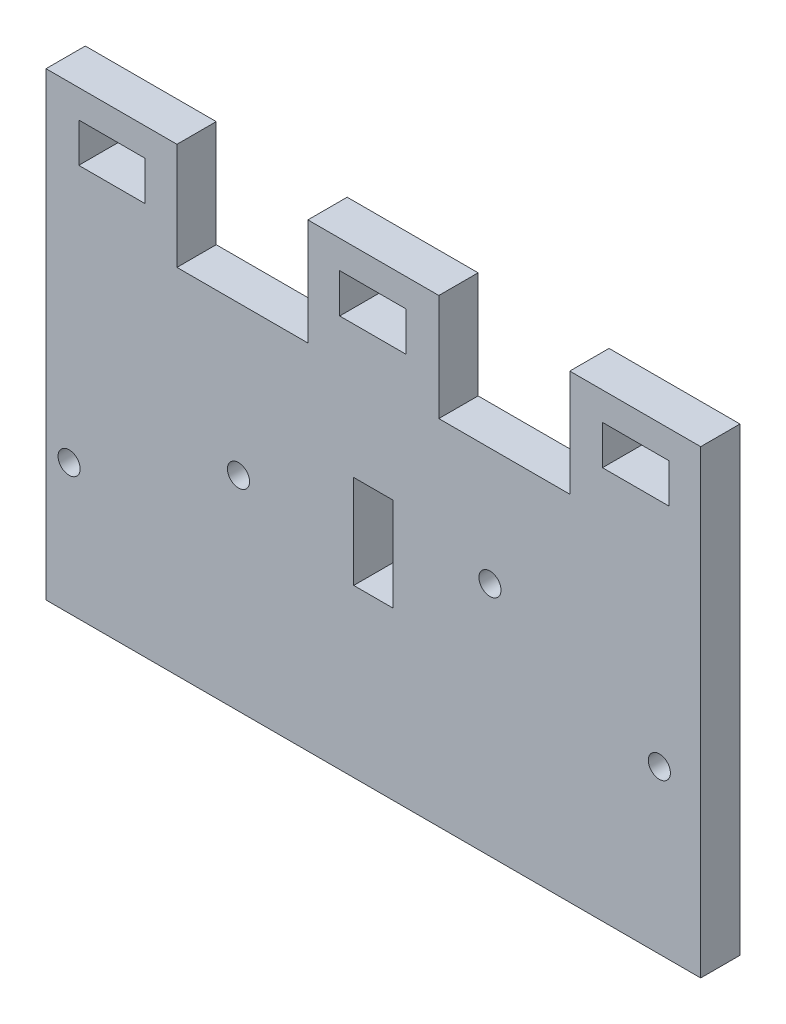
ISO-10303-21;
HEADER;
FILE_DESCRIPTION(('STEP AP214'),'2;1');
FILE_NAME('part.step','',(''),(''),'','','');
FILE_SCHEMA(('AUTOMOTIVE_DESIGN { 1 0 10303 214 1 1 1 1 }'));
ENDSEC;
DATA;
#1=APPLICATION_CONTEXT('core data for automotive mechanical design processes');
#2=APPLICATION_PROTOCOL_DEFINITION('international standard','automotive_design',2000,#1);
#3=PRODUCT_CONTEXT('',#1,'mechanical');
#4=PRODUCT('Part','Part','',(#3));
#5=PRODUCT_RELATED_PRODUCT_CATEGORY('part','',(#4));
#6=PRODUCT_DEFINITION_FORMATION('','',#4);
#7=PRODUCT_DEFINITION_CONTEXT('part definition',#1,'design');
#8=PRODUCT_DEFINITION('design','',#6,#7);
#9=PRODUCT_DEFINITION_SHAPE('','',#8);
#10=(LENGTH_UNIT() NAMED_UNIT(*) SI_UNIT(.MILLI.,.METRE.));
#11=(NAMED_UNIT(*) PLANE_ANGLE_UNIT() SI_UNIT($,.RADIAN.));
#12=(NAMED_UNIT(*) SI_UNIT($,.STERADIAN.) SOLID_ANGLE_UNIT());
#13=UNCERTAINTY_MEASURE_WITH_UNIT(LENGTH_MEASURE(1.E-05),#10,'distance_accuracy_value','');
#14=(GEOMETRIC_REPRESENTATION_CONTEXT(3) GLOBAL_UNCERTAINTY_ASSIGNED_CONTEXT((#13)) GLOBAL_UNIT_ASSIGNED_CONTEXT((#10,
#11,#12)) REPRESENTATION_CONTEXT('',''));
#15=CARTESIAN_POINT('',(0.,0.,0.));
#16=DIRECTION('',(0.,0.,1.));
#17=DIRECTION('',(1.,0.,0.));
#18=AXIS2_PLACEMENT_3D('',#15,#16,#17);
#19=CARTESIAN_POINT('',(-39.3603053435114,14.4208015267176,5.334));
#20=DIRECTION('',(0.,-1.,0.));
#21=DIRECTION('',(0.,0.,-1.));
#22=AXIS2_PLACEMENT_3D('',#19,#20,#21);
#23=PLANE('',#22);
#24=DIRECTION('',(-1.,0.,0.));
#25=VECTOR('',#24,1.);
#26=CARTESIAN_POINT('',(-39.3603053435114,14.4208015267176,5.334));
#27=LINE('',#26,#25);
#28=CARTESIAN_POINT('',(13.9796946564886,14.4208015267176,5.334));
#29=VERTEX_POINT('',#28);
#30=CARTESIAN_POINT('',(-3.80030534351144,14.4208015267176,5.334));
#31=VERTEX_POINT('',#30);
#32=EDGE_CURVE('E423',#29,#31,#27,.T.);
#33=ORIENTED_EDGE('',*,*,#32,.F.);
#34=DIRECTION('',(0.,0.,1.));
#35=VECTOR('',#34,1.);
#36=CARTESIAN_POINT('',(13.9796946564886,14.4208015267176,0.));
#37=LINE('',#36,#35);
#38=CARTESIAN_POINT('',(13.9796946564886,14.4208015267176,0.));
#39=VERTEX_POINT('',#38);
#40=EDGE_CURVE('E374',#39,#29,#37,.T.);
#41=ORIENTED_EDGE('',*,*,#40,.F.);
#42=DIRECTION('',(-1.,0.,0.));
#43=VECTOR('',#42,1.);
#44=CARTESIAN_POINT('',(-39.3603053435114,14.4208015267176,0.));
#45=LINE('',#44,#43);
#46=CARTESIAN_POINT('',(-3.80030534351144,14.4208015267176,0.));
#47=VERTEX_POINT('',#46);
#48=EDGE_CURVE('E433',#39,#47,#45,.T.);
#49=ORIENTED_EDGE('',*,*,#48,.T.);
#50=DIRECTION('',(0.,0.,1.));
#51=VECTOR('',#50,1.);
#52=CARTESIAN_POINT('',(-3.80030534351144,14.4208015267176,0.));
#53=LINE('',#52,#51);
#54=EDGE_CURVE('E404',#47,#31,#53,.T.);
#55=ORIENTED_EDGE('',*,*,#54,.T.);
#56=EDGE_LOOP('',(#33,#41,#49,#55));
#57=FACE_BOUND('',#56,.T.);
#58=ADVANCED_FACE('F35',(#57),#23,.F.);
#59=CARTESIAN_POINT('',(-21.5803053435114,14.4208015267176,5.334));
#60=VERTEX_POINT('',#59);
#61=CARTESIAN_POINT('',(-39.3603053435114,14.4208015267176,5.334));
#62=VERTEX_POINT('',#61);
#63=EDGE_CURVE('E418',#60,#62,#27,.T.);
#64=ORIENTED_EDGE('',*,*,#63,.F.);
#65=DIRECTION('',(0.,0.,1.));
#66=VECTOR('',#65,1.);
#67=CARTESIAN_POINT('',(-21.5803053435114,14.4208015267176,0.));
#68=LINE('',#67,#66);
#69=CARTESIAN_POINT('',(-21.5803053435114,14.4208015267176,0.));
#70=VERTEX_POINT('',#69);
#71=EDGE_CURVE('E401',#70,#60,#68,.T.);
#72=ORIENTED_EDGE('',*,*,#71,.F.);
#73=CARTESIAN_POINT('',(-39.3603053435114,14.4208015267176,0.));
#74=VERTEX_POINT('',#73);
#75=EDGE_CURVE('E430',#70,#74,#45,.T.);
#76=ORIENTED_EDGE('',*,*,#75,.T.);
#77=DIRECTION('',(0.,0.,-1.));
#78=VECTOR('',#77,1.);
#79=CARTESIAN_POINT('',(-39.3603053435114,14.4208015267176,5.334));
#80=LINE('',#79,#78);
#81=EDGE_CURVE('E422',#62,#74,#80,.T.);
#82=ORIENTED_EDGE('',*,*,#81,.F.);
#83=EDGE_LOOP('',(#64,#72,#76,#82));
#84=FACE_BOUND('',#83,.T.);
#85=ADVANCED_FACE('F480',(#84),#23,.F.);
#86=CARTESIAN_POINT('',(-39.3603053435114,14.4208015267176,5.334));
#87=DIRECTION('',(1.,0.,0.));
#88=DIRECTION('',(0.,1.,0.));
#89=AXIS2_PLACEMENT_3D('',#86,#87,#88);
#90=PLANE('',#89);
#91=DIRECTION('',(0.,-1.,0.));
#92=VECTOR('',#91,1.);
#93=CARTESIAN_POINT('',(-39.3603053435114,14.4208015267176,0.));
#94=LINE('',#93,#92);
#95=CARTESIAN_POINT('',(-39.3603053435114,-48.0631984732824,0.));
#96=VERTEX_POINT('',#95);
#97=EDGE_CURVE('E403',#74,#96,#94,.T.);
#98=ORIENTED_EDGE('',*,*,#97,.T.);
#99=DIRECTION('',(0.,0.,-1.));
#100=VECTOR('',#99,1.);
#101=CARTESIAN_POINT('',(-39.3603053435114,-48.0631984732824,5.334));
#102=LINE('',#101,#100);
#103=CARTESIAN_POINT('',(-39.3603053435114,-48.0631984732824,5.334));
#104=VERTEX_POINT('',#103);
#105=EDGE_CURVE('E11',#104,#96,#102,.T.);
#106=ORIENTED_EDGE('',*,*,#105,.F.);
#107=DIRECTION('',(0.,-1.,0.));
#108=VECTOR('',#107,1.);
#109=CARTESIAN_POINT('',(-39.3603053435114,14.4208015267176,5.334));
#110=LINE('',#109,#108);
#111=EDGE_CURVE('E410',#62,#104,#110,.T.);
#112=ORIENTED_EDGE('',*,*,#111,.F.);
#113=ORIENTED_EDGE('',*,*,#81,.T.);
#114=EDGE_LOOP('',(#98,#106,#112,#113));
#115=FACE_BOUND('',#114,.T.);
#116=ADVANCED_FACE('F37',(#115),#90,.F.);
#117=CARTESIAN_POINT('',(-39.3603053435114,-48.0631984732824,5.334));
#118=DIRECTION('',(0.,1.,0.));
#119=DIRECTION('',(0.,0.,1.));
#120=AXIS2_PLACEMENT_3D('',#117,#118,#119);
#121=PLANE('',#120);
#122=DIRECTION('',(1.,0.,0.));
#123=VECTOR('',#122,1.);
#124=CARTESIAN_POINT('',(-39.3603053435114,-48.0631984732824,0.));
#125=LINE('',#124,#123);
#126=CARTESIAN_POINT('',(49.5396946564886,-48.0631984732824,0.));
#127=VERTEX_POINT('',#126);
#128=EDGE_CURVE('E426',#96,#127,#125,.T.);
#129=ORIENTED_EDGE('',*,*,#128,.T.);
#130=DIRECTION('',(0.,0.,-1.));
#131=VECTOR('',#130,1.);
#132=CARTESIAN_POINT('',(49.5396946564886,-48.0631984732824,5.334));
#133=LINE('',#132,#131);
#134=CARTESIAN_POINT('',(49.5396946564886,-48.0631984732824,5.334));
#135=VERTEX_POINT('',#134);
#136=EDGE_CURVE('E43',#135,#127,#133,.T.);
#137=ORIENTED_EDGE('',*,*,#136,.F.);
#138=DIRECTION('',(1.,0.,0.));
#139=VECTOR('',#138,1.);
#140=CARTESIAN_POINT('',(-39.3603053435114,-48.0631984732824,5.334));
#141=LINE('',#140,#139);
#142=EDGE_CURVE('E413',#104,#135,#141,.T.);
#143=ORIENTED_EDGE('',*,*,#142,.F.);
#144=ORIENTED_EDGE('',*,*,#105,.T.);
#145=EDGE_LOOP('',(#129,#137,#143,#144));
#146=FACE_BOUND('',#145,.T.);
#147=ADVANCED_FACE('F460',(#146),#121,.F.);
#148=CARTESIAN_POINT('',(49.5396946564886,14.4208015267176,5.334));
#149=DIRECTION('',(-1.,0.,0.));
#150=DIRECTION('',(0.,0.,1.));
#151=AXIS2_PLACEMENT_3D('',#148,#149,#150);
#152=PLANE('',#151);
#153=DIRECTION('',(0.,1.,0.));
#154=VECTOR('',#153,1.);
#155=CARTESIAN_POINT('',(49.5396946564886,14.4208015267176,0.));
#156=LINE('',#155,#154);
#157=CARTESIAN_POINT('',(49.5396946564886,14.4208015267176,0.));
#158=VERTEX_POINT('',#157);
#159=EDGE_CURVE('E428',#127,#158,#156,.T.);
#160=ORIENTED_EDGE('',*,*,#159,.T.);
#161=DIRECTION('',(0.,0.,-1.));
#162=VECTOR('',#161,1.);
#163=CARTESIAN_POINT('',(49.5396946564886,14.4208015267176,5.334));
#164=LINE('',#163,#162);
#165=CARTESIAN_POINT('',(49.5396946564886,14.4208015267176,5.334));
#166=VERTEX_POINT('',#165);
#167=EDGE_CURVE('E436',#166,#158,#164,.T.);
#168=ORIENTED_EDGE('',*,*,#167,.F.);
#169=DIRECTION('',(0.,1.,0.));
#170=VECTOR('',#169,1.);
#171=CARTESIAN_POINT('',(49.5396946564886,14.4208015267176,5.334));
#172=LINE('',#171,#170);
#173=EDGE_CURVE('E416',#135,#166,#172,.T.);
#174=ORIENTED_EDGE('',*,*,#173,.F.);
#175=ORIENTED_EDGE('',*,*,#136,.T.);
#176=EDGE_LOOP('',(#160,#168,#174,#175));
#177=FACE_BOUND('',#176,.T.);
#178=ADVANCED_FACE('F443',(#177),#152,.F.);
#179=CARTESIAN_POINT('',(31.7596946564886,14.4208015267176,0.));
#180=VERTEX_POINT('',#179);
#181=EDGE_CURVE('E414',#158,#180,#45,.T.);
#182=ORIENTED_EDGE('',*,*,#181,.T.);
#183=DIRECTION('',(0.,0.,1.));
#184=VECTOR('',#183,1.);
#185=CARTESIAN_POINT('',(31.7596946564886,14.4208015267176,0.));
#186=LINE('',#185,#184);
#187=CARTESIAN_POINT('',(31.7596946564886,14.4208015267176,5.334));
#188=VERTEX_POINT('',#187);
#189=EDGE_CURVE('E377',#180,#188,#186,.T.);
#190=ORIENTED_EDGE('',*,*,#189,.T.);
#191=EDGE_CURVE('E419',#166,#188,#27,.T.);
#192=ORIENTED_EDGE('',*,*,#191,.F.);
#193=ORIENTED_EDGE('',*,*,#167,.T.);
#194=EDGE_LOOP('',(#182,#190,#192,#193));
#195=FACE_BOUND('',#194,.T.);
#196=ADVANCED_FACE('F451',(#195),#23,.F.);
#197=CARTESIAN_POINT('',(0.,0.,5.334));
#198=DIRECTION('',(0.,0.,1.));
#199=DIRECTION('',(1.,0.,0.));
#200=AXIS2_PLACEMENT_3D('',#197,#198,#199);
#201=PLANE('',#200);
#202=CARTESIAN_POINT('',(-13.2253053435115,-20.3291984732823,5.334));
#203=DIRECTION('',(0.,0.,1.));
#204=DIRECTION('',(1.,0.,0.));
#205=AXIS2_PLACEMENT_3D('',#202,#203,#204);
#206=CIRCLE('',#205,1.50000000000063);
#207=CARTESIAN_POINT('',(-11.7253053435109,-20.3291984732823,5.334));
#208=VERTEX_POINT('',#207);
#209=EDGE_CURVE('E799',#208,#208,#206,.T.);
#210=ORIENTED_EDGE('',*,*,#209,.F.);
#211=EDGE_LOOP('',(#210));
#212=FACE_BOUND('',#211,.T.);
#213=CARTESIAN_POINT('',(43.9246946564889,-26.0111984732834,5.334));
#214=DIRECTION('',(0.,0.,1.));
#215=DIRECTION('',(1.,0.,0.));
#216=AXIS2_PLACEMENT_3D('',#213,#214,#215);
#217=CIRCLE('',#216,1.50000000000195);
#218=CARTESIAN_POINT('',(45.4246946564909,-26.0111984732834,5.334));
#219=VERTEX_POINT('',#218);
#220=EDGE_CURVE('E803',#219,#219,#217,.T.);
#221=ORIENTED_EDGE('',*,*,#220,.F.);
#222=EDGE_LOOP('',(#221));
#223=FACE_BOUND('',#222,.T.);
#224=CARTESIAN_POINT('',(20.9246946564889,-16.0111984732834,5.334));
#225=DIRECTION('',(0.,0.,1.));
#226=DIRECTION('',(1.,0.,0.));
#227=AXIS2_PLACEMENT_3D('',#224,#225,#226);
#228=CIRCLE('',#227,1.50000000000195);
#229=CARTESIAN_POINT('',(22.4246946564909,-16.0111984732834,5.334));
#230=VERTEX_POINT('',#229);
#231=EDGE_CURVE('E810',#230,#230,#228,.T.);
#232=ORIENTED_EDGE('',*,*,#231,.F.);
#233=EDGE_LOOP('',(#232));
#234=FACE_BOUND('',#233,.T.);
#235=CARTESIAN_POINT('',(-36.2253053435115,-30.3291984732823,5.334));
#236=DIRECTION('',(0.,0.,1.));
#237=DIRECTION('',(1.,0.,0.));
#238=AXIS2_PLACEMENT_3D('',#235,#236,#237);
#239=CIRCLE('',#238,1.50000000000063);
#240=CARTESIAN_POINT('',(-34.7253053435109,-30.3291984732823,5.334));
#241=VERTEX_POINT('',#240);
#242=EDGE_CURVE('E244',#241,#241,#239,.T.);
#243=ORIENTED_EDGE('',*,*,#242,.F.);
#244=EDGE_LOOP('',(#243));
#245=FACE_BOUND('',#244,.T.);
#246=DIRECTION('',(0.,-1.,0.));
#247=VECTOR('',#246,1.);
#248=CARTESIAN_POINT('',(2.42269465648857,-12.7571984732824,5.334));
#249=LINE('',#248,#247);
#250=CARTESIAN_POINT('',(2.42269465648857,-12.7571984732824,5.334));
#251=VERTEX_POINT('',#250);
#252=CARTESIAN_POINT('',(2.42269465648857,-25.4571984732824,5.334));
#253=VERTEX_POINT('',#252);
#254=EDGE_CURVE('E50',#251,#253,#249,.T.);
#255=ORIENTED_EDGE('',*,*,#254,.F.);
#256=DIRECTION('',(-1.,0.,0.));
#257=VECTOR('',#256,1.);
#258=CARTESIAN_POINT('',(2.42269465648857,-12.7571984732824,5.334));
#259=LINE('',#258,#257);
#260=CARTESIAN_POINT('',(7.75669465648856,-12.7571984732824,5.334));
#261=VERTEX_POINT('',#260);
#262=EDGE_CURVE('E238',#261,#251,#259,.T.);
#263=ORIENTED_EDGE('',*,*,#262,.F.);
#264=DIRECTION('',(0.,1.,0.));
#265=VECTOR('',#264,1.);
#266=CARTESIAN_POINT('',(7.75669465648856,-12.7571984732824,5.334));
#267=LINE('',#266,#265);
#268=CARTESIAN_POINT('',(7.75669465648857,-25.4571984732824,5.334));
#269=VERTEX_POINT('',#268);
#270=EDGE_CURVE('E241',#269,#261,#267,.T.);
#271=ORIENTED_EDGE('',*,*,#270,.F.);
#272=DIRECTION('',(1.,0.,0.));
#273=VECTOR('',#272,1.);
#274=CARTESIAN_POINT('',(2.42269465648857,-25.4571984732824,5.334));
#275=LINE('',#274,#273);
#276=EDGE_CURVE('E250',#253,#269,#275,.T.);
#277=ORIENTED_EDGE('',*,*,#276,.F.);
#278=EDGE_LOOP('',(#255,#263,#271,#277));
#279=FACE_BOUND('',#278,.T.);
#280=DIRECTION('',(0.,-1.,0.));
#281=VECTOR('',#280,1.);
#282=CARTESIAN_POINT('',(36.2046946564886,10.6108015267176,5.334));
#283=LINE('',#282,#281);
#284=CARTESIAN_POINT('',(36.2046946564886,10.6108015267176,5.334));
#285=VERTEX_POINT('',#284);
#286=CARTESIAN_POINT('',(36.2046946564886,5.27680152671757,5.334));
#287=VERTEX_POINT('',#286);
#288=EDGE_CURVE('E257',#285,#287,#283,.T.);
#289=ORIENTED_EDGE('',*,*,#288,.F.);
#290=DIRECTION('',(-1.,0.,0.));
#291=VECTOR('',#290,1.);
#292=CARTESIAN_POINT('',(36.2046946564886,10.6108015267176,5.334));
#293=LINE('',#292,#291);
#294=CARTESIAN_POINT('',(45.2216946564886,10.6108015267176,5.334));
#295=VERTEX_POINT('',#294);
#296=EDGE_CURVE('E265',#295,#285,#293,.T.);
#297=ORIENTED_EDGE('',*,*,#296,.F.);
#298=DIRECTION('',(0.,1.,0.));
#299=VECTOR('',#298,1.);
#300=CARTESIAN_POINT('',(45.2216946564886,10.6108015267176,5.334));
#301=LINE('',#300,#299);
#302=CARTESIAN_POINT('',(45.2216946564886,5.27680152671757,5.334));
#303=VERTEX_POINT('',#302);
#304=EDGE_CURVE('E279',#303,#295,#301,.T.);
#305=ORIENTED_EDGE('',*,*,#304,.F.);
#306=DIRECTION('',(1.,0.,0.));
#307=VECTOR('',#306,1.);
#308=CARTESIAN_POINT('',(36.2046946564886,5.27680152671757,5.334));
#309=LINE('',#308,#307);
#310=EDGE_CURVE('E276',#287,#303,#309,.T.);
#311=ORIENTED_EDGE('',*,*,#310,.F.);
#312=EDGE_LOOP('',(#289,#297,#305,#311));
#313=FACE_BOUND('',#312,.T.);
#314=DIRECTION('',(-1.,0.,0.));
#315=VECTOR('',#314,1.);
#316=CARTESIAN_POINT('',(9.53469465648856,10.6108015267176,5.334));
#317=LINE('',#316,#315);
#318=CARTESIAN_POINT('',(9.53469465648856,10.6108015267176,5.334));
#319=VERTEX_POINT('',#318);
#320=CARTESIAN_POINT('',(0.51769465648855,10.6108015267176,5.334));
#321=VERTEX_POINT('',#320);
#322=EDGE_CURVE('E286',#319,#321,#317,.T.);
#323=ORIENTED_EDGE('',*,*,#322,.F.);
#324=DIRECTION('',(0.,1.,0.));
#325=VECTOR('',#324,1.);
#326=CARTESIAN_POINT('',(9.53469465648856,10.6108015267176,5.334));
#327=LINE('',#326,#325);
#328=CARTESIAN_POINT('',(9.53469465648857,5.27680152671757,5.334));
#329=VERTEX_POINT('',#328);
#330=EDGE_CURVE('E297',#329,#319,#327,.T.);
#331=ORIENTED_EDGE('',*,*,#330,.F.);
#332=DIRECTION('',(1.,0.,0.));
#333=VECTOR('',#332,1.);
#334=CARTESIAN_POINT('',(9.53469465648857,5.27680152671757,5.334));
#335=LINE('',#334,#333);
#336=CARTESIAN_POINT('',(0.51769465648855,5.27680152671757,5.334));
#337=VERTEX_POINT('',#336);
#338=EDGE_CURVE('E311',#337,#329,#335,.T.);
#339=ORIENTED_EDGE('',*,*,#338,.F.);
#340=DIRECTION('',(0.,-1.,0.));
#341=VECTOR('',#340,1.);
#342=CARTESIAN_POINT('',(0.51769465648855,10.6108015267176,5.334));
#343=LINE('',#342,#341);
#344=EDGE_CURVE('E308',#321,#337,#343,.T.);
#345=ORIENTED_EDGE('',*,*,#344,.F.);
#346=EDGE_LOOP('',(#323,#331,#339,#345));
#347=FACE_BOUND('',#346,.T.);
#348=DIRECTION('',(0.,-1.,0.));
#349=VECTOR('',#348,1.);
#350=CARTESIAN_POINT('',(-34.9153053435114,10.6108015267176,5.334));
#351=LINE('',#350,#349);
#352=CARTESIAN_POINT('',(-34.9153053435114,10.6108015267176,5.334));
#353=VERTEX_POINT('',#352);
#354=CARTESIAN_POINT('',(-34.9153053435114,5.27680152671757,5.334));
#355=VERTEX_POINT('',#354);
#356=EDGE_CURVE('E318',#353,#355,#351,.T.);
#357=ORIENTED_EDGE('',*,*,#356,.F.);
#358=DIRECTION('',(-1.,0.,0.));
#359=VECTOR('',#358,1.);
#360=CARTESIAN_POINT('',(-34.9153053435114,10.6108015267176,5.334));
#361=LINE('',#360,#359);
#362=CARTESIAN_POINT('',(-25.8983053435114,10.6108015267176,5.334));
#363=VERTEX_POINT('',#362);
#364=EDGE_CURVE('E329',#363,#353,#361,.T.);
#365=ORIENTED_EDGE('',*,*,#364,.F.);
#366=DIRECTION('',(0.,1.,0.));
#367=VECTOR('',#366,1.);
#368=CARTESIAN_POINT('',(-25.8983053435114,10.6108015267176,5.334));
#369=LINE('',#368,#367);
#370=CARTESIAN_POINT('',(-25.8983053435114,5.27680152671757,5.334));
#371=VERTEX_POINT('',#370);
#372=EDGE_CURVE('E343',#371,#363,#369,.T.);
#373=ORIENTED_EDGE('',*,*,#372,.F.);
#374=DIRECTION('',(1.,0.,0.));
#375=VECTOR('',#374,1.);
#376=CARTESIAN_POINT('',(-34.9153053435114,5.27680152671757,5.334));
#377=LINE('',#376,#375);
#378=EDGE_CURVE('E340',#355,#371,#377,.T.);
#379=ORIENTED_EDGE('',*,*,#378,.F.);
#380=EDGE_LOOP('',(#357,#365,#373,#379));
#381=FACE_BOUND('',#380,.T.);
#382=DIRECTION('',(0.,-1.,0.));
#383=VECTOR('',#382,1.);
#384=CARTESIAN_POINT('',(13.9796946564886,14.4208015267176,5.334));
#385=LINE('',#384,#383);
#386=CARTESIAN_POINT('',(13.9796946564886,-0.0571984732824337,5.334));
#387=VERTEX_POINT('',#386);
#388=EDGE_CURVE('E350',#29,#387,#385,.T.);
#389=ORIENTED_EDGE('',*,*,#388,.F.);
#390=ORIENTED_EDGE('',*,*,#32,.T.);
#391=DIRECTION('',(0.,1.,0.));
#392=VECTOR('',#391,1.);
#393=CARTESIAN_POINT('',(-3.80030534351144,14.4208015267176,5.334));
#394=LINE('',#393,#392);
#395=CARTESIAN_POINT('',(-3.80030534351144,-0.0571984732824337,5.334));
#396=VERTEX_POINT('',#395);
#397=EDGE_CURVE('E387',#396,#31,#394,.T.);
#398=ORIENTED_EDGE('',*,*,#397,.F.);
#399=DIRECTION('',(1.,0.,0.));
#400=VECTOR('',#399,1.);
#401=CARTESIAN_POINT('',(-21.5803053435114,-0.0571984732824337,5.334));
#402=LINE('',#401,#400);
#403=CARTESIAN_POINT('',(-21.5803053435114,-0.0571984732824337,5.334));
#404=VERTEX_POINT('',#403);
#405=EDGE_CURVE('E396',#404,#396,#402,.T.);
#406=ORIENTED_EDGE('',*,*,#405,.F.);
#407=DIRECTION('',(0.,-1.,0.));
#408=VECTOR('',#407,1.);
#409=CARTESIAN_POINT('',(-21.5803053435114,14.4208015267176,5.334));
#410=LINE('',#409,#408);
#411=EDGE_CURVE('E376',#60,#404,#410,.T.);
#412=ORIENTED_EDGE('',*,*,#411,.F.);
#413=ORIENTED_EDGE('',*,*,#63,.T.);
#414=ORIENTED_EDGE('',*,*,#111,.T.);
#415=ORIENTED_EDGE('',*,*,#142,.T.);
#416=ORIENTED_EDGE('',*,*,#173,.T.);
#417=ORIENTED_EDGE('',*,*,#191,.T.);
#418=DIRECTION('',(0.,1.,0.));
#419=VECTOR('',#418,1.);
#420=CARTESIAN_POINT('',(31.7596946564886,14.4208015267176,5.334));
#421=LINE('',#420,#419);
#422=CARTESIAN_POINT('',(31.7596946564886,-0.0571984732824337,5.334));
#423=VERTEX_POINT('',#422);
#424=EDGE_CURVE('E361',#423,#188,#421,.T.);
#425=ORIENTED_EDGE('',*,*,#424,.F.);
#426=DIRECTION('',(1.,0.,0.));
#427=VECTOR('',#426,1.);
#428=CARTESIAN_POINT('',(13.9796946564886,-0.0571984732824337,5.334));
#429=LINE('',#428,#427);
#430=EDGE_CURVE('E370',#387,#423,#429,.T.);
#431=ORIENTED_EDGE('',*,*,#430,.F.);
#432=EDGE_LOOP('',(#389,#390,#398,#406,#412,#413,#414,#415,#416,#417,#425,#431));
#433=FACE_BOUND('',#432,.T.);
#434=ADVANCED_FACE('F456',(#212,#223,#234,#245,#279,#313,#347,#381,#433),#201,.T.);
#435=CARTESIAN_POINT('',(0.,0.,0.));
#436=DIRECTION('',(0.,0.,1.));
#437=DIRECTION('',(1.,0.,0.));
#438=AXIS2_PLACEMENT_3D('',#435,#436,#437);
#439=PLANE('',#438);
#440=CARTESIAN_POINT('',(-13.2253053435115,-20.3291984732823,0.));
#441=DIRECTION('',(0.,0.,1.));
#442=DIRECTION('',(1.,0.,0.));
#443=AXIS2_PLACEMENT_3D('',#440,#441,#442);
#444=CIRCLE('',#443,1.50000000000063);
#445=CARTESIAN_POINT('',(-11.7253053435109,-20.3291984732823,0.));
#446=VERTEX_POINT('',#445);
#447=EDGE_CURVE('E796',#446,#446,#444,.T.);
#448=ORIENTED_EDGE('',*,*,#447,.T.);
#449=EDGE_LOOP('',(#448));
#450=FACE_BOUND('',#449,.T.);
#451=CARTESIAN_POINT('',(43.9246946564889,-26.0111984732834,0.));
#452=DIRECTION('',(0.,0.,1.));
#453=DIRECTION('',(1.,0.,0.));
#454=AXIS2_PLACEMENT_3D('',#451,#452,#453);
#455=CIRCLE('',#454,1.50000000000195);
#456=CARTESIAN_POINT('',(45.4246946564909,-26.0111984732834,0.));
#457=VERTEX_POINT('',#456);
#458=EDGE_CURVE('E800',#457,#457,#455,.T.);
#459=ORIENTED_EDGE('',*,*,#458,.T.);
#460=EDGE_LOOP('',(#459));
#461=FACE_BOUND('',#460,.T.);
#462=CARTESIAN_POINT('',(20.9246946564889,-16.0111984732834,0.));
#463=DIRECTION('',(0.,0.,1.));
#464=DIRECTION('',(1.,0.,0.));
#465=AXIS2_PLACEMENT_3D('',#462,#463,#464);
#466=CIRCLE('',#465,1.50000000000195);
#467=CARTESIAN_POINT('',(22.4246946564909,-16.0111984732834,0.));
#468=VERTEX_POINT('',#467);
#469=EDGE_CURVE('E808',#468,#468,#466,.T.);
#470=ORIENTED_EDGE('',*,*,#469,.T.);
#471=EDGE_LOOP('',(#470));
#472=FACE_BOUND('',#471,.T.);
#473=CARTESIAN_POINT('',(-36.2253053435115,-30.3291984732823,0.));
#474=DIRECTION('',(0.,0.,1.));
#475=DIRECTION('',(1.,0.,0.));
#476=AXIS2_PLACEMENT_3D('',#473,#474,#475);
#477=CIRCLE('',#476,1.50000000000063);
#478=CARTESIAN_POINT('',(-34.7253053435109,-30.3291984732823,0.));
#479=VERTEX_POINT('',#478);
#480=EDGE_CURVE('E251',#479,#479,#477,.T.);
#481=ORIENTED_EDGE('',*,*,#480,.T.);
#482=EDGE_LOOP('',(#481));
#483=FACE_BOUND('',#482,.T.);
#484=DIRECTION('',(-1.,0.,0.));
#485=VECTOR('',#484,1.);
#486=CARTESIAN_POINT('',(2.42269465648857,-12.7571984732824,0.));
#487=LINE('',#486,#485);
#488=CARTESIAN_POINT('',(7.75669465648856,-12.7571984732824,0.));
#489=VERTEX_POINT('',#488);
#490=CARTESIAN_POINT('',(2.42269465648857,-12.7571984732824,0.));
#491=VERTEX_POINT('',#490);
#492=EDGE_CURVE('E228',#489,#491,#487,.T.);
#493=ORIENTED_EDGE('',*,*,#492,.T.);
#494=DIRECTION('',(0.,-1.,0.));
#495=VECTOR('',#494,1.);
#496=CARTESIAN_POINT('',(2.42269465648857,-12.7571984732824,0.));
#497=LINE('',#496,#495);
#498=CARTESIAN_POINT('',(2.42269465648857,-25.4571984732824,0.));
#499=VERTEX_POINT('',#498);
#500=EDGE_CURVE('E222',#491,#499,#497,.T.);
#501=ORIENTED_EDGE('',*,*,#500,.T.);
#502=DIRECTION('',(1.,0.,0.));
#503=VECTOR('',#502,1.);
#504=CARTESIAN_POINT('',(2.42269465648857,-25.4571984732824,0.));
#505=LINE('',#504,#503);
#506=CARTESIAN_POINT('',(7.75669465648857,-25.4571984732824,0.));
#507=VERTEX_POINT('',#506);
#508=EDGE_CURVE('E231',#499,#507,#505,.T.);
#509=ORIENTED_EDGE('',*,*,#508,.T.);
#510=DIRECTION('',(0.,1.,0.));
#511=VECTOR('',#510,1.);
#512=CARTESIAN_POINT('',(7.75669465648856,-12.7571984732824,0.));
#513=LINE('',#512,#511);
#514=EDGE_CURVE('E58',#507,#489,#513,.T.);
#515=ORIENTED_EDGE('',*,*,#514,.T.);
#516=EDGE_LOOP('',(#493,#501,#509,#515));
#517=FACE_BOUND('',#516,.T.);
#518=DIRECTION('',(-1.,0.,0.));
#519=VECTOR('',#518,1.);
#520=CARTESIAN_POINT('',(36.2046946564886,10.6108015267176,0.));
#521=LINE('',#520,#519);
#522=CARTESIAN_POINT('',(45.2216946564886,10.6108015267176,0.));
#523=VERTEX_POINT('',#522);
#524=CARTESIAN_POINT('',(36.2046946564886,10.6108015267176,0.));
#525=VERTEX_POINT('',#524);
#526=EDGE_CURVE('E271',#523,#525,#521,.T.);
#527=ORIENTED_EDGE('',*,*,#526,.T.);
#528=DIRECTION('',(0.,-1.,0.));
#529=VECTOR('',#528,1.);
#530=CARTESIAN_POINT('',(36.2046946564886,10.6108015267176,0.));
#531=LINE('',#530,#529);
#532=CARTESIAN_POINT('',(36.2046946564886,5.27680152671757,0.));
#533=VERTEX_POINT('',#532);
#534=EDGE_CURVE('E261',#525,#533,#531,.T.);
#535=ORIENTED_EDGE('',*,*,#534,.T.);
#536=DIRECTION('',(1.,0.,0.));
#537=VECTOR('',#536,1.);
#538=CARTESIAN_POINT('',(36.2046946564886,5.27680152671757,0.));
#539=LINE('',#538,#537);
#540=CARTESIAN_POINT('',(45.2216946564886,5.27680152671757,0.));
#541=VERTEX_POINT('',#540);
#542=EDGE_CURVE('E264',#533,#541,#539,.T.);
#543=ORIENTED_EDGE('',*,*,#542,.T.);
#544=DIRECTION('',(0.,1.,0.));
#545=VECTOR('',#544,1.);
#546=CARTESIAN_POINT('',(45.2216946564886,10.6108015267176,0.));
#547=LINE('',#546,#545);
#548=EDGE_CURVE('E268',#541,#523,#547,.T.);
#549=ORIENTED_EDGE('',*,*,#548,.T.);
#550=EDGE_LOOP('',(#527,#535,#543,#549));
#551=FACE_BOUND('',#550,.T.);
#552=DIRECTION('',(0.,1.,0.));
#553=VECTOR('',#552,1.);
#554=CARTESIAN_POINT('',(9.53469465648856,10.6108015267176,0.));
#555=LINE('',#554,#553);
#556=CARTESIAN_POINT('',(9.53469465648857,5.27680152671757,0.));
#557=VERTEX_POINT('',#556);
#558=CARTESIAN_POINT('',(9.53469465648856,10.6108015267176,0.));
#559=VERTEX_POINT('',#558);
#560=EDGE_CURVE('E303',#557,#559,#555,.T.);
#561=ORIENTED_EDGE('',*,*,#560,.T.);
#562=DIRECTION('',(-1.,0.,0.));
#563=VECTOR('',#562,1.);
#564=CARTESIAN_POINT('',(9.53469465648856,10.6108015267176,0.));
#565=LINE('',#564,#563);
#566=CARTESIAN_POINT('',(0.51769465648855,10.6108015267176,0.));
#567=VERTEX_POINT('',#566);
#568=EDGE_CURVE('E293',#559,#567,#565,.T.);
#569=ORIENTED_EDGE('',*,*,#568,.T.);
#570=DIRECTION('',(0.,-1.,0.));
#571=VECTOR('',#570,1.);
#572=CARTESIAN_POINT('',(0.51769465648855,10.6108015267176,0.));
#573=LINE('',#572,#571);
#574=CARTESIAN_POINT('',(0.51769465648855,5.27680152671757,0.));
#575=VERTEX_POINT('',#574);
#576=EDGE_CURVE('E296',#567,#575,#573,.T.);
#577=ORIENTED_EDGE('',*,*,#576,.T.);
#578=DIRECTION('',(1.,0.,0.));
#579=VECTOR('',#578,1.);
#580=CARTESIAN_POINT('',(9.53469465648857,5.27680152671757,0.));
#581=LINE('',#580,#579);
#582=EDGE_CURVE('E300',#575,#557,#581,.T.);
#583=ORIENTED_EDGE('',*,*,#582,.T.);
#584=EDGE_LOOP('',(#561,#569,#577,#583));
#585=FACE_BOUND('',#584,.T.);
#586=DIRECTION('',(-1.,0.,0.));
#587=VECTOR('',#586,1.);
#588=CARTESIAN_POINT('',(-34.9153053435114,10.6108015267176,0.));
#589=LINE('',#588,#587);
#590=CARTESIAN_POINT('',(-25.8983053435114,10.6108015267176,0.));
#591=VERTEX_POINT('',#590);
#592=CARTESIAN_POINT('',(-34.9153053435114,10.6108015267176,0.));
#593=VERTEX_POINT('',#592);
#594=EDGE_CURVE('E335',#591,#593,#589,.T.);
#595=ORIENTED_EDGE('',*,*,#594,.T.);
#596=DIRECTION('',(0.,-1.,0.));
#597=VECTOR('',#596,1.);
#598=CARTESIAN_POINT('',(-34.9153053435114,10.6108015267176,0.));
#599=LINE('',#598,#597);
#600=CARTESIAN_POINT('',(-34.9153053435114,5.27680152671757,0.));
#601=VERTEX_POINT('',#600);
#602=EDGE_CURVE('E325',#593,#601,#599,.T.);
#603=ORIENTED_EDGE('',*,*,#602,.T.);
#604=DIRECTION('',(1.,0.,0.));
#605=VECTOR('',#604,1.);
#606=CARTESIAN_POINT('',(-34.9153053435114,5.27680152671757,0.));
#607=LINE('',#606,#605);
#608=CARTESIAN_POINT('',(-25.8983053435114,5.27680152671757,0.));
#609=VERTEX_POINT('',#608);
#610=EDGE_CURVE('E328',#601,#609,#607,.T.);
#611=ORIENTED_EDGE('',*,*,#610,.T.);
#612=DIRECTION('',(0.,1.,0.));
#613=VECTOR('',#612,1.);
#614=CARTESIAN_POINT('',(-25.8983053435114,10.6108015267176,0.));
#615=LINE('',#614,#613);
#616=EDGE_CURVE('E332',#609,#591,#615,.T.);
#617=ORIENTED_EDGE('',*,*,#616,.T.);
#618=EDGE_LOOP('',(#595,#603,#611,#617));
#619=FACE_BOUND('',#618,.T.);
#620=ORIENTED_EDGE('',*,*,#48,.F.);
#621=DIRECTION('',(0.,-1.,0.));
#622=VECTOR('',#621,1.);
#623=CARTESIAN_POINT('',(13.9796946564886,14.4208015267176,0.));
#624=LINE('',#623,#622);
#625=CARTESIAN_POINT('',(13.9796946564886,-0.0571984732824337,0.));
#626=VERTEX_POINT('',#625);
#627=EDGE_CURVE('E357',#39,#626,#624,.T.);
#628=ORIENTED_EDGE('',*,*,#627,.T.);
#629=DIRECTION('',(1.,0.,0.));
#630=VECTOR('',#629,1.);
#631=CARTESIAN_POINT('',(13.9796946564886,-0.0571984732824337,0.));
#632=LINE('',#631,#630);
#633=CARTESIAN_POINT('',(31.7596946564886,-0.0571984732824337,0.));
#634=VERTEX_POINT('',#633);
#635=EDGE_CURVE('E360',#626,#634,#632,.T.);
#636=ORIENTED_EDGE('',*,*,#635,.T.);
#637=DIRECTION('',(0.,1.,0.));
#638=VECTOR('',#637,1.);
#639=CARTESIAN_POINT('',(31.7596946564886,14.4208015267176,0.));
#640=LINE('',#639,#638);
#641=EDGE_CURVE('E364',#634,#180,#640,.T.);
#642=ORIENTED_EDGE('',*,*,#641,.T.);
#643=ORIENTED_EDGE('',*,*,#181,.F.);
#644=ORIENTED_EDGE('',*,*,#159,.F.);
#645=ORIENTED_EDGE('',*,*,#128,.F.);
#646=ORIENTED_EDGE('',*,*,#97,.F.);
#647=ORIENTED_EDGE('',*,*,#75,.F.);
#648=DIRECTION('',(0.,-1.,0.));
#649=VECTOR('',#648,1.);
#650=CARTESIAN_POINT('',(-21.5803053435114,14.4208015267176,0.));
#651=LINE('',#650,#649);
#652=CARTESIAN_POINT('',(-21.5803053435114,-0.0571984732824337,0.));
#653=VERTEX_POINT('',#652);
#654=EDGE_CURVE('E383',#70,#653,#651,.T.);
#655=ORIENTED_EDGE('',*,*,#654,.T.);
#656=DIRECTION('',(1.,0.,0.));
#657=VECTOR('',#656,1.);
#658=CARTESIAN_POINT('',(-21.5803053435114,-0.0571984732824337,0.));
#659=LINE('',#658,#657);
#660=CARTESIAN_POINT('',(-3.80030534351144,-0.0571984732824337,0.));
#661=VERTEX_POINT('',#660);
#662=EDGE_CURVE('E386',#653,#661,#659,.T.);
#663=ORIENTED_EDGE('',*,*,#662,.T.);
#664=DIRECTION('',(0.,1.,0.));
#665=VECTOR('',#664,1.);
#666=CARTESIAN_POINT('',(-3.80030534351144,14.4208015267176,0.));
#667=LINE('',#666,#665);
#668=EDGE_CURVE('E390',#661,#47,#667,.T.);
#669=ORIENTED_EDGE('',*,*,#668,.T.);
#670=EDGE_LOOP('',(#620,#628,#636,#642,#643,#644,#645,#646,#647,#655,#663,#669));
#671=FACE_BOUND('',#670,.T.);
#672=ADVANCED_FACE('F235',(#450,#461,#472,#483,#517,#551,#585,#619,#671),#439,.F.);
#673=CARTESIAN_POINT('',(-21.5803053435114,14.4208015267176,0.));
#674=DIRECTION('',(-1.,0.,0.));
#675=DIRECTION('',(0.,-1.,0.));
#676=AXIS2_PLACEMENT_3D('',#673,#674,#675);
#677=PLANE('',#676);
#678=ORIENTED_EDGE('',*,*,#411,.T.);
#679=DIRECTION('',(0.,0.,1.));
#680=VECTOR('',#679,1.);
#681=CARTESIAN_POINT('',(-21.5803053435114,-0.0571984732824337,0.));
#682=LINE('',#681,#680);
#683=EDGE_CURVE('E393',#653,#404,#682,.T.);
#684=ORIENTED_EDGE('',*,*,#683,.F.);
#685=ORIENTED_EDGE('',*,*,#654,.F.);
#686=ORIENTED_EDGE('',*,*,#71,.T.);
#687=EDGE_LOOP('',(#678,#684,#685,#686));
#688=FACE_BOUND('',#687,.T.);
#689=ADVANCED_FACE('F533',(#688),#677,.F.);
#690=CARTESIAN_POINT('',(-3.80030534351144,14.4208015267176,0.));
#691=DIRECTION('',(1.,0.,0.));
#692=DIRECTION('',(0.,1.,0.));
#693=AXIS2_PLACEMENT_3D('',#690,#691,#692);
#694=PLANE('',#693);
#695=ORIENTED_EDGE('',*,*,#397,.T.);
#696=ORIENTED_EDGE('',*,*,#54,.F.);
#697=ORIENTED_EDGE('',*,*,#668,.F.);
#698=DIRECTION('',(0.,0.,1.));
#699=VECTOR('',#698,1.);
#700=CARTESIAN_POINT('',(-3.80030534351144,-0.0571984732824337,0.));
#701=LINE('',#700,#699);
#702=EDGE_CURVE('E407',#661,#396,#701,.T.);
#703=ORIENTED_EDGE('',*,*,#702,.T.);
#704=EDGE_LOOP('',(#695,#696,#697,#703));
#705=FACE_BOUND('',#704,.T.);
#706=ADVANCED_FACE('F471',(#705),#694,.F.);
#707=CARTESIAN_POINT('',(-21.5803053435114,-0.0571984732824337,0.));
#708=DIRECTION('',(0.,-1.,0.));
#709=DIRECTION('',(0.,0.,-1.));
#710=AXIS2_PLACEMENT_3D('',#707,#708,#709);
#711=PLANE('',#710);
#712=ORIENTED_EDGE('',*,*,#405,.T.);
#713=ORIENTED_EDGE('',*,*,#702,.F.);
#714=ORIENTED_EDGE('',*,*,#662,.F.);
#715=ORIENTED_EDGE('',*,*,#683,.T.);
#716=EDGE_LOOP('',(#712,#713,#714,#715));
#717=FACE_BOUND('',#716,.T.);
#718=ADVANCED_FACE('F476',(#717),#711,.F.);
#719=CARTESIAN_POINT('',(13.9796946564886,14.4208015267176,0.));
#720=DIRECTION('',(-1.,0.,0.));
#721=DIRECTION('',(0.,-1.,0.));
#722=AXIS2_PLACEMENT_3D('',#719,#720,#721);
#723=PLANE('',#722);
#724=ORIENTED_EDGE('',*,*,#388,.T.);
#725=DIRECTION('',(0.,0.,1.));
#726=VECTOR('',#725,1.);
#727=CARTESIAN_POINT('',(13.9796946564886,-0.0571984732824337,0.));
#728=LINE('',#727,#726);
#729=EDGE_CURVE('E367',#626,#387,#728,.T.);
#730=ORIENTED_EDGE('',*,*,#729,.F.);
#731=ORIENTED_EDGE('',*,*,#627,.F.);
#732=ORIENTED_EDGE('',*,*,#40,.T.);
#733=EDGE_LOOP('',(#724,#730,#731,#732));
#734=FACE_BOUND('',#733,.T.);
#735=ADVANCED_FACE('F564',(#734),#723,.F.);
#736=CARTESIAN_POINT('',(31.7596946564886,14.4208015267176,0.));
#737=DIRECTION('',(1.,0.,0.));
#738=DIRECTION('',(0.,1.,0.));
#739=AXIS2_PLACEMENT_3D('',#736,#737,#738);
#740=PLANE('',#739);
#741=ORIENTED_EDGE('',*,*,#424,.T.);
#742=ORIENTED_EDGE('',*,*,#189,.F.);
#743=ORIENTED_EDGE('',*,*,#641,.F.);
#744=DIRECTION('',(0.,0.,1.));
#745=VECTOR('',#744,1.);
#746=CARTESIAN_POINT('',(31.7596946564886,-0.0571984732824337,0.));
#747=LINE('',#746,#745);
#748=EDGE_CURVE('E380',#634,#423,#747,.T.);
#749=ORIENTED_EDGE('',*,*,#748,.T.);
#750=EDGE_LOOP('',(#741,#742,#743,#749));
#751=FACE_BOUND('',#750,.T.);
#752=ADVANCED_FACE('F572',(#751),#740,.F.);
#753=CARTESIAN_POINT('',(13.9796946564886,-0.0571984732824337,0.));
#754=DIRECTION('',(0.,-1.,0.));
#755=DIRECTION('',(0.,0.,-1.));
#756=AXIS2_PLACEMENT_3D('',#753,#754,#755);
#757=PLANE('',#756);
#758=ORIENTED_EDGE('',*,*,#430,.T.);
#759=ORIENTED_EDGE('',*,*,#748,.F.);
#760=ORIENTED_EDGE('',*,*,#635,.F.);
#761=ORIENTED_EDGE('',*,*,#729,.T.);
#762=EDGE_LOOP('',(#758,#759,#760,#761));
#763=FACE_BOUND('',#762,.T.);
#764=ADVANCED_FACE('F581',(#763),#757,.F.);
#765=CARTESIAN_POINT('',(-34.9153053435114,10.6108015267176,0.));
#766=DIRECTION('',(-1.,0.,0.));
#767=DIRECTION('',(0.,-1.,0.));
#768=AXIS2_PLACEMENT_3D('',#765,#766,#767);
#769=PLANE('',#768);
#770=ORIENTED_EDGE('',*,*,#356,.T.);
#771=DIRECTION('',(0.,0.,1.));
#772=VECTOR('',#771,1.);
#773=CARTESIAN_POINT('',(-34.9153053435114,5.27680152671757,0.));
#774=LINE('',#773,#772);
#775=EDGE_CURVE('E338',#601,#355,#774,.T.);
#776=ORIENTED_EDGE('',*,*,#775,.F.);
#777=ORIENTED_EDGE('',*,*,#602,.F.);
#778=DIRECTION('',(0.,0.,1.));
#779=VECTOR('',#778,1.);
#780=CARTESIAN_POINT('',(-34.9153053435114,10.6108015267176,0.));
#781=LINE('',#780,#779);
#782=EDGE_CURVE('E348',#593,#353,#781,.T.);
#783=ORIENTED_EDGE('',*,*,#782,.T.);
#784=EDGE_LOOP('',(#770,#776,#777,#783));
#785=FACE_BOUND('',#784,.T.);
#786=ADVANCED_FACE('F590',(#785),#769,.F.);
#787=CARTESIAN_POINT('',(-34.9153053435114,10.6108015267176,0.));
#788=DIRECTION('',(0.,1.,0.));
#789=DIRECTION('',(0.,0.,1.));
#790=AXIS2_PLACEMENT_3D('',#787,#788,#789);
#791=PLANE('',#790);
#792=ORIENTED_EDGE('',*,*,#364,.T.);
#793=ORIENTED_EDGE('',*,*,#782,.F.);
#794=ORIENTED_EDGE('',*,*,#594,.F.);
#795=DIRECTION('',(0.,0.,1.));
#796=VECTOR('',#795,1.);
#797=CARTESIAN_POINT('',(-25.8983053435114,10.6108015267176,0.));
#798=LINE('',#797,#796);
#799=EDGE_CURVE('E351',#591,#363,#798,.T.);
#800=ORIENTED_EDGE('',*,*,#799,.T.);
#801=EDGE_LOOP('',(#792,#793,#794,#800));
#802=FACE_BOUND('',#801,.T.);
#803=ADVANCED_FACE('F599',(#802),#791,.F.);
#804=CARTESIAN_POINT('',(-25.8983053435114,10.6108015267176,0.));
#805=DIRECTION('',(1.,0.,0.));
#806=DIRECTION('',(0.,0.,-1.));
#807=AXIS2_PLACEMENT_3D('',#804,#805,#806);
#808=PLANE('',#807);
#809=ORIENTED_EDGE('',*,*,#372,.T.);
#810=ORIENTED_EDGE('',*,*,#799,.F.);
#811=ORIENTED_EDGE('',*,*,#616,.F.);
#812=DIRECTION('',(0.,0.,1.));
#813=VECTOR('',#812,1.);
#814=CARTESIAN_POINT('',(-25.8983053435114,5.27680152671757,0.));
#815=LINE('',#814,#813);
#816=EDGE_CURVE('E353',#609,#371,#815,.T.);
#817=ORIENTED_EDGE('',*,*,#816,.T.);
#818=EDGE_LOOP('',(#809,#810,#811,#817));
#819=FACE_BOUND('',#818,.T.);
#820=ADVANCED_FACE('F608',(#819),#808,.F.);
#821=CARTESIAN_POINT('',(-34.9153053435114,5.27680152671757,0.));
#822=DIRECTION('',(0.,-1.,0.));
#823=DIRECTION('',(0.,0.,-1.));
#824=AXIS2_PLACEMENT_3D('',#821,#822,#823);
#825=PLANE('',#824);
#826=ORIENTED_EDGE('',*,*,#378,.T.);
#827=ORIENTED_EDGE('',*,*,#816,.F.);
#828=ORIENTED_EDGE('',*,*,#610,.F.);
#829=ORIENTED_EDGE('',*,*,#775,.T.);
#830=EDGE_LOOP('',(#826,#827,#828,#829));
#831=FACE_BOUND('',#830,.T.);
#832=ADVANCED_FACE('F617',(#831),#825,.F.);
#833=CARTESIAN_POINT('',(9.53469465648856,10.6108015267176,0.));
#834=DIRECTION('',(0.,1.,0.));
#835=DIRECTION('',(0.,0.,1.));
#836=AXIS2_PLACEMENT_3D('',#833,#834,#835);
#837=PLANE('',#836);
#838=ORIENTED_EDGE('',*,*,#322,.T.);
#839=DIRECTION('',(0.,0.,1.));
#840=VECTOR('',#839,1.);
#841=CARTESIAN_POINT('',(0.51769465648855,10.6108015267176,0.));
#842=LINE('',#841,#840);
#843=EDGE_CURVE('E306',#567,#321,#842,.T.);
#844=ORIENTED_EDGE('',*,*,#843,.F.);
#845=ORIENTED_EDGE('',*,*,#568,.F.);
#846=DIRECTION('',(0.,0.,1.));
#847=VECTOR('',#846,1.);
#848=CARTESIAN_POINT('',(9.53469465648856,10.6108015267176,0.));
#849=LINE('',#848,#847);
#850=EDGE_CURVE('E316',#559,#319,#849,.T.);
#851=ORIENTED_EDGE('',*,*,#850,.T.);
#852=EDGE_LOOP('',(#838,#844,#845,#851));
#853=FACE_BOUND('',#852,.T.);
#854=ADVANCED_FACE('F626',(#853),#837,.F.);
#855=CARTESIAN_POINT('',(9.53469465648856,10.6108015267176,0.));
#856=DIRECTION('',(1.,0.,0.));
#857=DIRECTION('',(0.,1.,0.));
#858=AXIS2_PLACEMENT_3D('',#855,#856,#857);
#859=PLANE('',#858);
#860=ORIENTED_EDGE('',*,*,#330,.T.);
#861=ORIENTED_EDGE('',*,*,#850,.F.);
#862=ORIENTED_EDGE('',*,*,#560,.F.);
#863=DIRECTION('',(0.,0.,1.));
#864=VECTOR('',#863,1.);
#865=CARTESIAN_POINT('',(9.53469465648857,5.27680152671757,0.));
#866=LINE('',#865,#864);
#867=EDGE_CURVE('E319',#557,#329,#866,.T.);
#868=ORIENTED_EDGE('',*,*,#867,.T.);
#869=EDGE_LOOP('',(#860,#861,#862,#868));
#870=FACE_BOUND('',#869,.T.);
#871=ADVANCED_FACE('F635',(#870),#859,.F.);
#872=CARTESIAN_POINT('',(9.53469465648857,5.27680152671757,0.));
#873=DIRECTION('',(0.,-1.,0.));
#874=DIRECTION('',(0.,0.,-1.));
#875=AXIS2_PLACEMENT_3D('',#872,#873,#874);
#876=PLANE('',#875);
#877=ORIENTED_EDGE('',*,*,#338,.T.);
#878=ORIENTED_EDGE('',*,*,#867,.F.);
#879=ORIENTED_EDGE('',*,*,#582,.F.);
#880=DIRECTION('',(0.,0.,1.));
#881=VECTOR('',#880,1.);
#882=CARTESIAN_POINT('',(0.51769465648855,5.27680152671757,0.));
#883=LINE('',#882,#881);
#884=EDGE_CURVE('E321',#575,#337,#883,.T.);
#885=ORIENTED_EDGE('',*,*,#884,.T.);
#886=EDGE_LOOP('',(#877,#878,#879,#885));
#887=FACE_BOUND('',#886,.T.);
#888=ADVANCED_FACE('F644',(#887),#876,.F.);
#889=CARTESIAN_POINT('',(0.51769465648855,10.6108015267176,0.));
#890=DIRECTION('',(-1.,0.,0.));
#891=DIRECTION('',(0.,0.,1.));
#892=AXIS2_PLACEMENT_3D('',#889,#890,#891);
#893=PLANE('',#892);
#894=ORIENTED_EDGE('',*,*,#344,.T.);
#895=ORIENTED_EDGE('',*,*,#884,.F.);
#896=ORIENTED_EDGE('',*,*,#576,.F.);
#897=ORIENTED_EDGE('',*,*,#843,.T.);
#898=EDGE_LOOP('',(#894,#895,#896,#897));
#899=FACE_BOUND('',#898,.T.);
#900=ADVANCED_FACE('F653',(#899),#893,.F.);
#901=CARTESIAN_POINT('',(36.2046946564886,10.6108015267176,0.));
#902=DIRECTION('',(-1.,0.,0.));
#903=DIRECTION('',(0.,-1.,0.));
#904=AXIS2_PLACEMENT_3D('',#901,#902,#903);
#905=PLANE('',#904);
#906=ORIENTED_EDGE('',*,*,#288,.T.);
#907=DIRECTION('',(0.,0.,1.));
#908=VECTOR('',#907,1.);
#909=CARTESIAN_POINT('',(36.2046946564886,5.27680152671757,0.));
#910=LINE('',#909,#908);
#911=EDGE_CURVE('E274',#533,#287,#910,.T.);
#912=ORIENTED_EDGE('',*,*,#911,.F.);
#913=ORIENTED_EDGE('',*,*,#534,.F.);
#914=DIRECTION('',(0.,0.,1.));
#915=VECTOR('',#914,1.);
#916=CARTESIAN_POINT('',(36.2046946564886,10.6108015267176,0.));
#917=LINE('',#916,#915);
#918=EDGE_CURVE('E284',#525,#285,#917,.T.);
#919=ORIENTED_EDGE('',*,*,#918,.T.);
#920=EDGE_LOOP('',(#906,#912,#913,#919));
#921=FACE_BOUND('',#920,.T.);
#922=ADVANCED_FACE('F662',(#921),#905,.F.);
#923=CARTESIAN_POINT('',(36.2046946564886,10.6108015267176,0.));
#924=DIRECTION('',(0.,1.,0.));
#925=DIRECTION('',(0.,0.,1.));
#926=AXIS2_PLACEMENT_3D('',#923,#924,#925);
#927=PLANE('',#926);
#928=ORIENTED_EDGE('',*,*,#296,.T.);
#929=ORIENTED_EDGE('',*,*,#918,.F.);
#930=ORIENTED_EDGE('',*,*,#526,.F.);
#931=DIRECTION('',(0.,0.,1.));
#932=VECTOR('',#931,1.);
#933=CARTESIAN_POINT('',(45.2216946564886,10.6108015267176,0.));
#934=LINE('',#933,#932);
#935=EDGE_CURVE('E287',#523,#295,#934,.T.);
#936=ORIENTED_EDGE('',*,*,#935,.T.);
#937=EDGE_LOOP('',(#928,#929,#930,#936));
#938=FACE_BOUND('',#937,.T.);
#939=ADVANCED_FACE('F671',(#938),#927,.F.);
#940=CARTESIAN_POINT('',(45.2216946564886,10.6108015267176,0.));
#941=DIRECTION('',(1.,0.,0.));
#942=DIRECTION('',(0.,0.,-1.));
#943=AXIS2_PLACEMENT_3D('',#940,#941,#942);
#944=PLANE('',#943);
#945=ORIENTED_EDGE('',*,*,#304,.T.);
#946=ORIENTED_EDGE('',*,*,#935,.F.);
#947=ORIENTED_EDGE('',*,*,#548,.F.);
#948=DIRECTION('',(0.,0.,1.));
#949=VECTOR('',#948,1.);
#950=CARTESIAN_POINT('',(45.2216946564886,5.27680152671757,0.));
#951=LINE('',#950,#949);
#952=EDGE_CURVE('E289',#541,#303,#951,.T.);
#953=ORIENTED_EDGE('',*,*,#952,.T.);
#954=EDGE_LOOP('',(#945,#946,#947,#953));
#955=FACE_BOUND('',#954,.T.);
#956=ADVANCED_FACE('F680',(#955),#944,.F.);
#957=CARTESIAN_POINT('',(36.2046946564886,5.27680152671757,0.));
#958=DIRECTION('',(0.,-1.,0.));
#959=DIRECTION('',(0.,0.,-1.));
#960=AXIS2_PLACEMENT_3D('',#957,#958,#959);
#961=PLANE('',#960);
#962=ORIENTED_EDGE('',*,*,#310,.T.);
#963=ORIENTED_EDGE('',*,*,#952,.F.);
#964=ORIENTED_EDGE('',*,*,#542,.F.);
#965=ORIENTED_EDGE('',*,*,#911,.T.);
#966=EDGE_LOOP('',(#962,#963,#964,#965));
#967=FACE_BOUND('',#966,.T.);
#968=ADVANCED_FACE('F689',(#967),#961,.F.);
#969=CARTESIAN_POINT('',(2.42269465648857,-12.7571984732824,0.));
#970=DIRECTION('',(-1.,0.,0.));
#971=DIRECTION('',(0.,-1.,0.));
#972=AXIS2_PLACEMENT_3D('',#969,#970,#971);
#973=PLANE('',#972);
#974=ORIENTED_EDGE('',*,*,#254,.T.);
#975=DIRECTION('',(0.,0.,1.));
#976=VECTOR('',#975,1.);
#977=CARTESIAN_POINT('',(2.42269465648857,-25.4571984732824,0.));
#978=LINE('',#977,#976);
#979=EDGE_CURVE('E218',#499,#253,#978,.T.);
#980=ORIENTED_EDGE('',*,*,#979,.F.);
#981=ORIENTED_EDGE('',*,*,#500,.F.);
#982=DIRECTION('',(0.,0.,1.));
#983=VECTOR('',#982,1.);
#984=CARTESIAN_POINT('',(2.42269465648857,-12.7571984732824,0.));
#985=LINE('',#984,#983);
#986=EDGE_CURVE('E255',#491,#251,#985,.T.);
#987=ORIENTED_EDGE('',*,*,#986,.T.);
#988=EDGE_LOOP('',(#974,#980,#981,#987));
#989=FACE_BOUND('',#988,.T.);
#990=ADVANCED_FACE('F220',(#989),#973,.F.);
#991=CARTESIAN_POINT('',(2.42269465648857,-12.7571984732824,0.));
#992=DIRECTION('',(0.,1.,0.));
#993=DIRECTION('',(-1.,0.,0.));
#994=AXIS2_PLACEMENT_3D('',#991,#992,#993);
#995=PLANE('',#994);
#996=ORIENTED_EDGE('',*,*,#262,.T.);
#997=ORIENTED_EDGE('',*,*,#986,.F.);
#998=ORIENTED_EDGE('',*,*,#492,.F.);
#999=DIRECTION('',(0.,0.,1.));
#1000=VECTOR('',#999,1.);
#1001=CARTESIAN_POINT('',(7.75669465648856,-12.7571984732824,0.));
#1002=LINE('',#1001,#1000);
#1003=EDGE_CURVE('E258',#489,#261,#1002,.T.);
#1004=ORIENTED_EDGE('',*,*,#1003,.T.);
#1005=EDGE_LOOP('',(#996,#997,#998,#1004));
#1006=FACE_BOUND('',#1005,.T.);
#1007=ADVANCED_FACE('F706',(#1006),#995,.F.);
#1008=CARTESIAN_POINT('',(7.75669465648856,-12.7571984732824,0.));
#1009=DIRECTION('',(1.,0.,0.));
#1010=DIRECTION('',(0.,1.,0.));
#1011=AXIS2_PLACEMENT_3D('',#1008,#1009,#1010);
#1012=PLANE('',#1011);
#1013=ORIENTED_EDGE('',*,*,#270,.T.);
#1014=ORIENTED_EDGE('',*,*,#1003,.F.);
#1015=ORIENTED_EDGE('',*,*,#514,.F.);
#1016=DIRECTION('',(0.,0.,1.));
#1017=VECTOR('',#1016,1.);
#1018=CARTESIAN_POINT('',(7.75669465648857,-25.4571984732824,0.));
#1019=LINE('',#1018,#1017);
#1020=EDGE_CURVE('E227',#507,#269,#1019,.T.);
#1021=ORIENTED_EDGE('',*,*,#1020,.T.);
#1022=EDGE_LOOP('',(#1013,#1014,#1015,#1021));
#1023=FACE_BOUND('',#1022,.T.);
#1024=ADVANCED_FACE('F714',(#1023),#1012,.F.);
#1025=CARTESIAN_POINT('',(2.42269465648857,-25.4571984732824,0.));
#1026=DIRECTION('',(0.,-1.,0.));
#1027=DIRECTION('',(0.,0.,-1.));
#1028=AXIS2_PLACEMENT_3D('',#1025,#1026,#1027);
#1029=PLANE('',#1028);
#1030=ORIENTED_EDGE('',*,*,#276,.T.);
#1031=ORIENTED_EDGE('',*,*,#1020,.F.);
#1032=ORIENTED_EDGE('',*,*,#508,.F.);
#1033=ORIENTED_EDGE('',*,*,#979,.T.);
#1034=EDGE_LOOP('',(#1030,#1031,#1032,#1033));
#1035=FACE_BOUND('',#1034,.T.);
#1036=ADVANCED_FACE('F232',(#1035),#1029,.F.);
#1037=CARTESIAN_POINT('',(-36.2253053435115,-30.3291984732823,0.));
#1038=DIRECTION('',(0.,0.,1.));
#1039=DIRECTION('',(1.,0.,0.));
#1040=AXIS2_PLACEMENT_3D('',#1037,#1038,#1039);
#1041=CYLINDRICAL_SURFACE('',#1040,1.50000000000063);
#1042=ORIENTED_EDGE('',*,*,#480,.F.);
#1043=EDGE_LOOP('',(#1042));
#1044=FACE_BOUND('',#1043,.T.);
#1045=ORIENTED_EDGE('',*,*,#242,.T.);
#1046=EDGE_LOOP('',(#1045));
#1047=FACE_BOUND('',#1046,.T.);
#1048=ADVANCED_FACE('F729',(#1044,#1047),#1041,.F.);
#1049=CARTESIAN_POINT('',(20.9246946564889,-16.0111984732834,0.));
#1050=DIRECTION('',(0.,0.,1.));
#1051=DIRECTION('',(1.,0.,0.));
#1052=AXIS2_PLACEMENT_3D('',#1049,#1050,#1051);
#1053=CYLINDRICAL_SURFACE('',#1052,1.50000000000195);
#1054=ORIENTED_EDGE('',*,*,#469,.F.);
#1055=EDGE_LOOP('',(#1054));
#1056=FACE_BOUND('',#1055,.T.);
#1057=ORIENTED_EDGE('',*,*,#231,.T.);
#1058=EDGE_LOOP('',(#1057));
#1059=FACE_BOUND('',#1058,.T.);
#1060=ADVANCED_FACE('F736',(#1056,#1059),#1053,.F.);
#1061=CARTESIAN_POINT('',(43.9246946564889,-26.0111984732834,0.));
#1062=DIRECTION('',(0.,0.,1.));
#1063=DIRECTION('',(1.,0.,0.));
#1064=AXIS2_PLACEMENT_3D('',#1061,#1062,#1063);
#1065=CYLINDRICAL_SURFACE('',#1064,1.50000000000195);
#1066=ORIENTED_EDGE('',*,*,#458,.F.);
#1067=EDGE_LOOP('',(#1066));
#1068=FACE_BOUND('',#1067,.T.);
#1069=ORIENTED_EDGE('',*,*,#220,.T.);
#1070=EDGE_LOOP('',(#1069));
#1071=FACE_BOUND('',#1070,.T.);
#1072=ADVANCED_FACE('F745',(#1068,#1071),#1065,.F.);
#1073=CARTESIAN_POINT('',(-13.2253053435115,-20.3291984732823,0.));
#1074=DIRECTION('',(0.,0.,1.));
#1075=DIRECTION('',(1.,0.,0.));
#1076=AXIS2_PLACEMENT_3D('',#1073,#1074,#1075);
#1077=CYLINDRICAL_SURFACE('',#1076,1.50000000000063);
#1078=ORIENTED_EDGE('',*,*,#447,.F.);
#1079=EDGE_LOOP('',(#1078));
#1080=FACE_BOUND('',#1079,.T.);
#1081=ORIENTED_EDGE('',*,*,#209,.T.);
#1082=EDGE_LOOP('',(#1081));
#1083=FACE_BOUND('',#1082,.T.);
#1084=ADVANCED_FACE('F754',(#1080,#1083),#1077,.F.);
#1085=CLOSED_SHELL('',(#58,#85,#116,#147,#178,#196,#434,#672,#689,#706,#718,#735,#752,#764,#786,
#803,#820,#832,#854,#871,#888,#900,#922,#939,#956,#968,#990,#1007,#1024,#1036,#1048,#1060,#1072,#1084));
#1086=MANIFOLD_SOLID_BREP('B2',#1085);
#1087=ADVANCED_BREP_SHAPE_REPRESENTATION('',(#18,#1086),#14);
#1088=SHAPE_DEFINITION_REPRESENTATION(#9,#1087);
ENDSEC;
END-ISO-10303-21;
